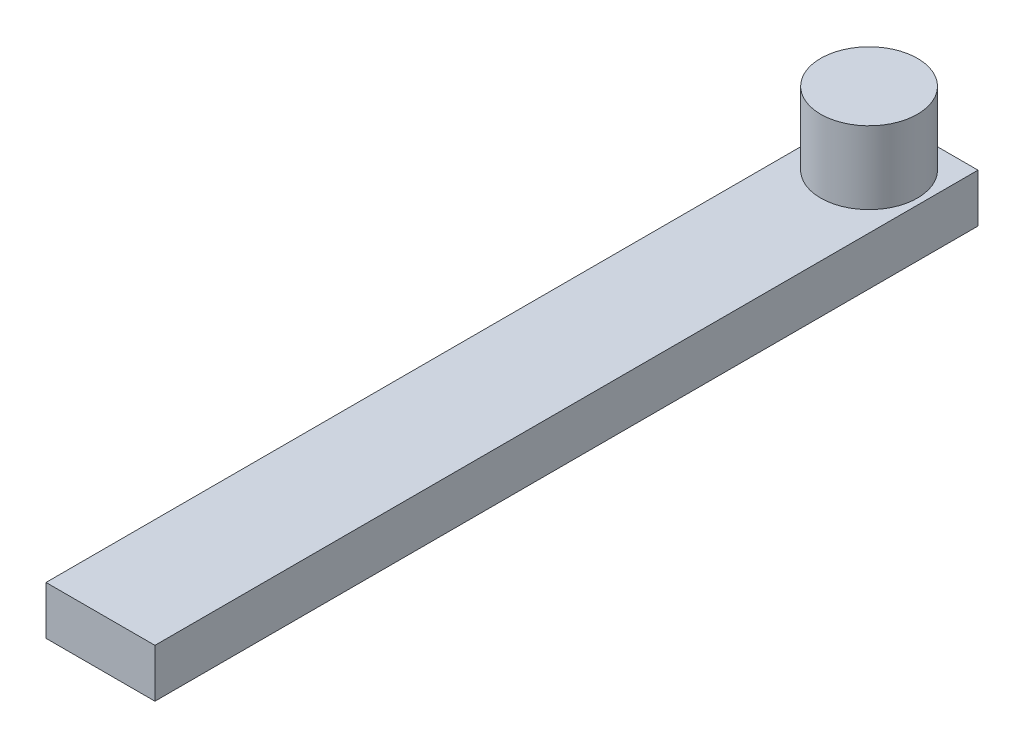
ISO-10303-21;
HEADER;
FILE_DESCRIPTION(('STEP AP214'),'2;1');
FILE_NAME('part.step','',(''),(''),'','','');
FILE_SCHEMA(('AUTOMOTIVE_DESIGN { 1 0 10303 214 1 1 1 1 }'));
ENDSEC;
DATA;
#1=APPLICATION_CONTEXT('core data for automotive mechanical design processes');
#2=APPLICATION_PROTOCOL_DEFINITION('international standard','automotive_design',2000,#1);
#3=PRODUCT_CONTEXT('',#1,'mechanical');
#4=PRODUCT('Part','Part','',(#3));
#5=PRODUCT_RELATED_PRODUCT_CATEGORY('part','',(#4));
#6=PRODUCT_DEFINITION_FORMATION('','',#4);
#7=PRODUCT_DEFINITION_CONTEXT('part definition',#1,'design');
#8=PRODUCT_DEFINITION('design','',#6,#7);
#9=PRODUCT_DEFINITION_SHAPE('','',#8);
#10=(LENGTH_UNIT() NAMED_UNIT(*) SI_UNIT(.MILLI.,.METRE.));
#11=(NAMED_UNIT(*) PLANE_ANGLE_UNIT() SI_UNIT($,.RADIAN.));
#12=(NAMED_UNIT(*) SI_UNIT($,.STERADIAN.) SOLID_ANGLE_UNIT());
#13=UNCERTAINTY_MEASURE_WITH_UNIT(LENGTH_MEASURE(1.E-05),#10,'distance_accuracy_value','');
#14=(GEOMETRIC_REPRESENTATION_CONTEXT(3) GLOBAL_UNCERTAINTY_ASSIGNED_CONTEXT((#13)) GLOBAL_UNIT_ASSIGNED_CONTEXT((#10,
#11,#12)) REPRESENTATION_CONTEXT('',''));
#15=CARTESIAN_POINT('',(0.,0.,0.));
#16=DIRECTION('',(0.,0.,1.));
#17=DIRECTION('',(1.,0.,0.));
#18=AXIS2_PLACEMENT_3D('',#15,#16,#17);
#19=CARTESIAN_POINT('',(0.,20.,0.));
#20=DIRECTION('',(0.,1.,0.));
#21=DIRECTION('',(0.,0.,1.));
#22=AXIS2_PLACEMENT_3D('',#19,#20,#21);
#23=PLANE('',#22);
#24=DIRECTION('',(-1.,0.,0.));
#25=VECTOR('',#24,1.);
#26=CARTESIAN_POINT('',(0.,20.,-60.));
#27=LINE('',#26,#25);
#28=CARTESIAN_POINT('',(45.,20.,-60.));
#29=VERTEX_POINT('',#28);
#30=CARTESIAN_POINT('',(0.,20.,-60.));
#31=VERTEX_POINT('',#30);
#32=EDGE_CURVE('E91',#29,#31,#27,.T.);
#33=ORIENTED_EDGE('',*,*,#32,.F.);
#34=DIRECTION('',(0.,0.,1.));
#35=VECTOR('',#34,1.);
#36=CARTESIAN_POINT('',(45.,20.,0.));
#37=LINE('',#36,#35);
#38=CARTESIAN_POINT('',(45.,20.,-400.));
#39=VERTEX_POINT('',#38);
#40=EDGE_CURVE('E80',#39,#29,#37,.T.);
#41=ORIENTED_EDGE('',*,*,#40,.F.);
#42=DIRECTION('',(1.,0.,0.));
#43=VECTOR('',#42,1.);
#44=CARTESIAN_POINT('',(0.,20.,-400.));
#45=LINE('',#44,#43);
#46=CARTESIAN_POINT('',(0.,20.,-400.));
#47=VERTEX_POINT('',#46);
#48=EDGE_CURVE('E90',#47,#39,#45,.T.);
#49=ORIENTED_EDGE('',*,*,#48,.F.);
#50=DIRECTION('',(0.,0.,-1.));
#51=VECTOR('',#50,1.);
#52=CARTESIAN_POINT('',(0.,20.,0.));
#53=LINE('',#52,#51);
#54=EDGE_CURVE('E94',#31,#47,#53,.T.);
#55=ORIENTED_EDGE('',*,*,#54,.F.);
#56=EDGE_LOOP('',(#33,#41,#49,#55));
#57=FACE_BOUND('',#56,.T.);
#58=CARTESIAN_POINT('',(22.5,20.,-377.5));
#59=DIRECTION('',(0.,1.,0.));
#60=DIRECTION('',(0.,0.,1.));
#61=AXIS2_PLACEMENT_3D('',#58,#59,#60);
#62=CIRCLE('',#61,20.);
#63=CARTESIAN_POINT('',(22.5,20.,-357.5));
#64=VERTEX_POINT('',#63);
#65=EDGE_CURVE('E111',#64,#64,#62,.T.);
#66=ORIENTED_EDGE('',*,*,#65,.F.);
#67=EDGE_LOOP('',(#66));
#68=FACE_BOUND('',#67,.T.);
#69=ADVANCED_FACE('F35',(#57,#68),#23,.T.);
#70=CARTESIAN_POINT('',(0.,20.,-60.));
#71=DIRECTION('',(0.,0.,1.));
#72=DIRECTION('',(1.,0.,0.));
#73=AXIS2_PLACEMENT_3D('',#70,#71,#72);
#74=PLANE('',#73);
#75=DIRECTION('',(-1.,0.,0.));
#76=VECTOR('',#75,1.);
#77=CARTESIAN_POINT('',(0.,0.,-60.));
#78=LINE('',#77,#76);
#79=CARTESIAN_POINT('',(45.,0.,-60.));
#80=VERTEX_POINT('',#79);
#81=CARTESIAN_POINT('',(0.,0.,-60.));
#82=VERTEX_POINT('',#81);
#83=EDGE_CURVE('E99',#80,#82,#78,.T.);
#84=ORIENTED_EDGE('',*,*,#83,.F.);
#85=DIRECTION('',(0.,-1.,0.));
#86=VECTOR('',#85,1.);
#87=CARTESIAN_POINT('',(45.,20.,-60.));
#88=LINE('',#87,#86);
#89=EDGE_CURVE('E11',#29,#80,#88,.T.);
#90=ORIENTED_EDGE('',*,*,#89,.F.);
#91=ORIENTED_EDGE('',*,*,#32,.T.);
#92=DIRECTION('',(0.,-1.,0.));
#93=VECTOR('',#92,1.);
#94=CARTESIAN_POINT('',(0.,20.,-60.));
#95=LINE('',#94,#93);
#96=EDGE_CURVE('E52',#31,#82,#95,.T.);
#97=ORIENTED_EDGE('',*,*,#96,.T.);
#98=EDGE_LOOP('',(#84,#90,#91,#97));
#99=FACE_BOUND('',#98,.T.);
#100=ADVANCED_FACE('F37',(#99),#74,.T.);
#101=CARTESIAN_POINT('',(45.,20.,0.));
#102=DIRECTION('',(1.,0.,0.));
#103=DIRECTION('',(0.,0.,-1.));
#104=AXIS2_PLACEMENT_3D('',#101,#102,#103);
#105=PLANE('',#104);
#106=DIRECTION('',(0.,0.,1.));
#107=VECTOR('',#106,1.);
#108=CARTESIAN_POINT('',(45.,0.,0.));
#109=LINE('',#108,#107);
#110=CARTESIAN_POINT('',(45.,0.,-400.));
#111=VERTEX_POINT('',#110);
#112=EDGE_CURVE('E82',#111,#80,#109,.T.);
#113=ORIENTED_EDGE('',*,*,#112,.F.);
#114=DIRECTION('',(0.,-1.,0.));
#115=VECTOR('',#114,1.);
#116=CARTESIAN_POINT('',(45.,20.,-400.));
#117=LINE('',#116,#115);
#118=EDGE_CURVE('E44',#39,#111,#117,.T.);
#119=ORIENTED_EDGE('',*,*,#118,.F.);
#120=ORIENTED_EDGE('',*,*,#40,.T.);
#121=ORIENTED_EDGE('',*,*,#89,.T.);
#122=EDGE_LOOP('',(#113,#119,#120,#121));
#123=FACE_BOUND('',#122,.T.);
#124=ADVANCED_FACE('F79',(#123),#105,.T.);
#125=CARTESIAN_POINT('',(0.,20.,-400.));
#126=DIRECTION('',(0.,0.,-1.));
#127=DIRECTION('',(-1.,0.,0.));
#128=AXIS2_PLACEMENT_3D('',#125,#126,#127);
#129=PLANE('',#128);
#130=DIRECTION('',(1.,0.,0.));
#131=VECTOR('',#130,1.);
#132=CARTESIAN_POINT('',(0.,0.,-400.));
#133=LINE('',#132,#131);
#134=CARTESIAN_POINT('',(0.,0.,-400.));
#135=VERTEX_POINT('',#134);
#136=EDGE_CURVE('E103',#135,#111,#133,.T.);
#137=ORIENTED_EDGE('',*,*,#136,.F.);
#138=DIRECTION('',(0.,-1.,0.));
#139=VECTOR('',#138,1.);
#140=CARTESIAN_POINT('',(0.,20.,-400.));
#141=LINE('',#140,#139);
#142=EDGE_CURVE('E65',#47,#135,#141,.T.);
#143=ORIENTED_EDGE('',*,*,#142,.F.);
#144=ORIENTED_EDGE('',*,*,#48,.T.);
#145=ORIENTED_EDGE('',*,*,#118,.T.);
#146=EDGE_LOOP('',(#137,#143,#144,#145));
#147=FACE_BOUND('',#146,.T.);
#148=ADVANCED_FACE('F93',(#147),#129,.T.);
#149=CARTESIAN_POINT('',(0.,20.,0.));
#150=DIRECTION('',(-1.,0.,0.));
#151=DIRECTION('',(0.,0.,1.));
#152=AXIS2_PLACEMENT_3D('',#149,#150,#151);
#153=PLANE('',#152);
#154=DIRECTION('',(0.,0.,-1.));
#155=VECTOR('',#154,1.);
#156=CARTESIAN_POINT('',(0.,0.,0.));
#157=LINE('',#156,#155);
#158=EDGE_CURVE('E105',#82,#135,#157,.T.);
#159=ORIENTED_EDGE('',*,*,#158,.F.);
#160=ORIENTED_EDGE('',*,*,#96,.F.);
#161=ORIENTED_EDGE('',*,*,#54,.T.);
#162=ORIENTED_EDGE('',*,*,#142,.T.);
#163=EDGE_LOOP('',(#159,#160,#161,#162));
#164=FACE_BOUND('',#163,.T.);
#165=ADVANCED_FACE('F134',(#164),#153,.T.);
#166=CARTESIAN_POINT('',(0.,0.,0.));
#167=DIRECTION('',(0.,1.,0.));
#168=DIRECTION('',(0.,0.,1.));
#169=AXIS2_PLACEMENT_3D('',#166,#167,#168);
#170=PLANE('',#169);
#171=ORIENTED_EDGE('',*,*,#83,.T.);
#172=ORIENTED_EDGE('',*,*,#158,.T.);
#173=ORIENTED_EDGE('',*,*,#136,.T.);
#174=ORIENTED_EDGE('',*,*,#112,.T.);
#175=EDGE_LOOP('',(#171,#172,#173,#174));
#176=FACE_BOUND('',#175,.T.);
#177=ADVANCED_FACE('F122',(#176),#170,.F.);
#178=CARTESIAN_POINT('',(22.5,50.,-377.5));
#179=DIRECTION('',(0.,-1.,0.));
#180=DIRECTION('',(0.,0.,-1.));
#181=AXIS2_PLACEMENT_3D('',#178,#179,#180);
#182=CYLINDRICAL_SURFACE('',#181,20.);
#183=CARTESIAN_POINT('',(22.5,50.,-377.5));
#184=DIRECTION('',(0.,1.,0.));
#185=DIRECTION('',(0.,0.,1.));
#186=AXIS2_PLACEMENT_3D('',#183,#184,#185);
#187=CIRCLE('',#186,20.);
#188=CARTESIAN_POINT('',(22.5,50.,-357.5));
#189=VERTEX_POINT('',#188);
#190=EDGE_CURVE('E101',#189,#189,#187,.T.);
#191=ORIENTED_EDGE('',*,*,#190,.F.);
#192=EDGE_LOOP('',(#191));
#193=FACE_BOUND('',#192,.T.);
#194=ORIENTED_EDGE('',*,*,#65,.T.);
#195=EDGE_LOOP('',(#194));
#196=FACE_BOUND('',#195,.T.);
#197=ADVANCED_FACE('F119',(#193,#196),#182,.T.);
#198=CARTESIAN_POINT('',(0.,50.,0.));
#199=DIRECTION('',(0.,1.,0.));
#200=DIRECTION('',(0.,0.,1.));
#201=AXIS2_PLACEMENT_3D('',#198,#199,#200);
#202=PLANE('',#201);
#203=ORIENTED_EDGE('',*,*,#190,.T.);
#204=EDGE_LOOP('',(#203));
#205=FACE_BOUND('',#204,.T.);
#206=ADVANCED_FACE('F117',(#205),#202,.T.);
#207=CLOSED_SHELL('',(#69,#100,#124,#148,#165,#177,#197,#206));
#208=MANIFOLD_SOLID_BREP('B2',#207);
#209=ADVANCED_BREP_SHAPE_REPRESENTATION('',(#18,#208),#14);
#210=SHAPE_DEFINITION_REPRESENTATION(#9,#209);
ENDSEC;
END-ISO-10303-21;
